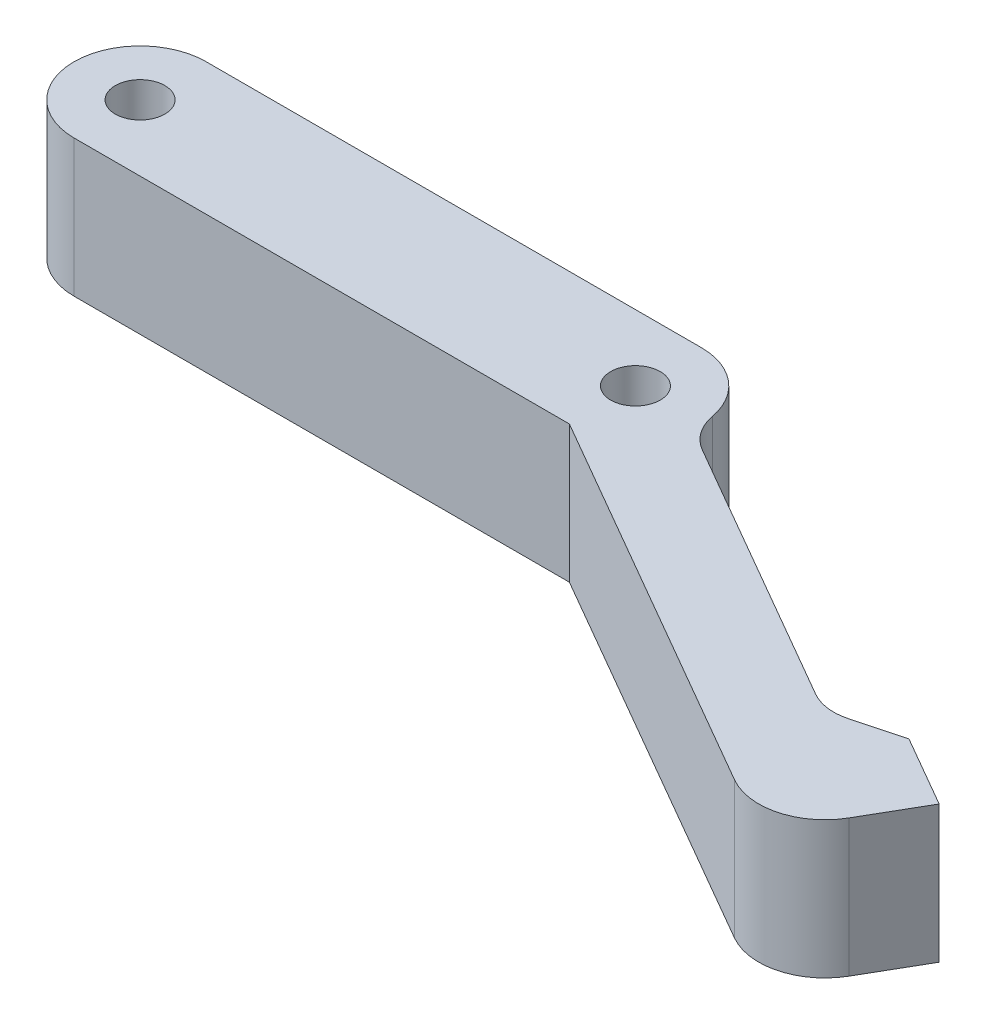
ISO-10303-21;
HEADER;
FILE_DESCRIPTION(('STEP AP214'),'2;1');
FILE_NAME('part.step','',(''),(''),'','','');
FILE_SCHEMA(('AUTOMOTIVE_DESIGN { 1 0 10303 214 1 1 1 1 }'));
ENDSEC;
DATA;
#1=APPLICATION_CONTEXT('core data for automotive mechanical design processes');
#2=APPLICATION_PROTOCOL_DEFINITION('international standard','automotive_design',2000,#1);
#3=PRODUCT_CONTEXT('',#1,'mechanical');
#4=PRODUCT('Part','Part','',(#3));
#5=PRODUCT_RELATED_PRODUCT_CATEGORY('part','',(#4));
#6=PRODUCT_DEFINITION_FORMATION('','',#4);
#7=PRODUCT_DEFINITION_CONTEXT('part definition',#1,'design');
#8=PRODUCT_DEFINITION('design','',#6,#7);
#9=PRODUCT_DEFINITION_SHAPE('','',#8);
#10=(LENGTH_UNIT() NAMED_UNIT(*) SI_UNIT(.MILLI.,.METRE.));
#11=(NAMED_UNIT(*) PLANE_ANGLE_UNIT() SI_UNIT($,.RADIAN.));
#12=(NAMED_UNIT(*) SI_UNIT($,.STERADIAN.) SOLID_ANGLE_UNIT());
#13=UNCERTAINTY_MEASURE_WITH_UNIT(LENGTH_MEASURE(1.E-05),#10,'distance_accuracy_value','');
#14=(GEOMETRIC_REPRESENTATION_CONTEXT(3) GLOBAL_UNCERTAINTY_ASSIGNED_CONTEXT((#13)) GLOBAL_UNIT_ASSIGNED_CONTEXT((#10,
#11,#12)) REPRESENTATION_CONTEXT('',''));
#15=CARTESIAN_POINT('',(0.,0.,0.));
#16=DIRECTION('',(0.,0.,1.));
#17=DIRECTION('',(1.,0.,0.));
#18=AXIS2_PLACEMENT_3D('',#15,#16,#17);
#19=CARTESIAN_POINT('',(8.2679491924312,8.3,-14.3205080756891));
#20=DIRECTION('',(0.499999999999995,0.,-0.866025403784442));
#21=DIRECTION('',(-0.866025403784442,0.,-0.499999999999995));
#22=AXIS2_PLACEMENT_3D('',#19,#20,#21);
#23=PLANE('',#22);
#24=DIRECTION('',(0.866025403784442,0.,0.499999999999995));
#25=VECTOR('',#24,1.);
#26=CARTESIAN_POINT('',(8.2679491924312,8.3,-14.3205080756891));
#27=LINE('',#26,#25);
#28=CARTESIAN_POINT('',(35.3852232130684,8.3,1.33565737981441));
#29=VERTEX_POINT('',#28);
#30=CARTESIAN_POINT('',(51.6230048712079,8.3,10.7105449911835));
#31=VERTEX_POINT('',#30);
#32=EDGE_CURVE('E128',#29,#31,#27,.T.);
#33=ORIENTED_EDGE('',*,*,#32,.T.);
#34=DIRECTION('',(0.,-1.,0.));
#35=VECTOR('',#34,1.);
#36=CARTESIAN_POINT('',(51.6230048712079,0.,10.7105449911835));
#37=LINE('',#36,#35);
#38=CARTESIAN_POINT('',(51.6230048712079,0.,10.7105449911835));
#39=VERTEX_POINT('',#38);
#40=EDGE_CURVE('E213',#31,#39,#37,.T.);
#41=ORIENTED_EDGE('',*,*,#40,.T.);
#42=DIRECTION('',(0.866025403784442,0.,0.499999999999995));
#43=VECTOR('',#42,1.);
#44=CARTESIAN_POINT('',(8.2679491924312,0.,-14.3205080756891));
#45=LINE('',#44,#43);
#46=CARTESIAN_POINT('',(35.3852232130684,0.,1.33565737981441));
#47=VERTEX_POINT('',#46);
#48=EDGE_CURVE('E170',#47,#39,#45,.T.);
#49=ORIENTED_EDGE('',*,*,#48,.F.);
#50=DIRECTION('',(0.,-1.,0.));
#51=VECTOR('',#50,1.);
#52=CARTESIAN_POINT('',(35.3852232130684,8.3,1.33565737981441));
#53=LINE('',#52,#51);
#54=EDGE_CURVE('E138',#47,#29,#53,.F.);
#55=ORIENTED_EDGE('',*,*,#54,.T.);
#56=EDGE_LOOP('',(#33,#41,#49,#55));
#57=FACE_BOUND('',#56,.T.);
#58=ADVANCED_FACE('F35',(#57),#23,.T.);
#59=CARTESIAN_POINT('',(30.,8.3,0.));
#60=DIRECTION('',(0.,-1.,0.));
#61=DIRECTION('',(0.,0.,-1.));
#62=AXIS2_PLACEMENT_3D('',#59,#60,#61);
#63=CYLINDRICAL_SURFACE('',#62,4.);
#64=CARTESIAN_POINT('',(30.,8.3,0.));
#65=DIRECTION('',(0.,1.,0.));
#66=DIRECTION('',(0.,0.,1.));
#67=AXIS2_PLACEMENT_3D('',#64,#65,#66);
#68=CIRCLE('',#67,4.);
#69=CARTESIAN_POINT('',(33.9344132646105,8.3,-0.721382189450805));
#70=VERTEX_POINT('',#69);
#71=CARTESIAN_POINT('',(30.,8.3,-4.));
#72=VERTEX_POINT('',#71);
#73=EDGE_CURVE('E121',#70,#72,#68,.T.);
#74=ORIENTED_EDGE('',*,*,#73,.F.);
#75=DIRECTION('',(0.,-1.,0.));
#76=VECTOR('',#75,1.);
#77=CARTESIAN_POINT('',(33.9344132646105,8.3,-0.721382189450805));
#78=LINE('',#77,#76);
#79=CARTESIAN_POINT('',(33.9344132646105,0.,-0.721382189450805));
#80=VERTEX_POINT('',#79);
#81=EDGE_CURVE('E218',#70,#80,#78,.T.);
#82=ORIENTED_EDGE('',*,*,#81,.T.);
#83=CARTESIAN_POINT('',(30.,0.,0.));
#84=DIRECTION('',(0.,1.,0.));
#85=DIRECTION('',(0.,0.,1.));
#86=AXIS2_PLACEMENT_3D('',#83,#84,#85);
#87=CIRCLE('',#86,4.);
#88=CARTESIAN_POINT('',(30.,0.,-4.));
#89=VERTEX_POINT('',#88);
#90=EDGE_CURVE('E134',#80,#89,#87,.T.);
#91=ORIENTED_EDGE('',*,*,#90,.T.);
#92=DIRECTION('',(0.,-1.,0.));
#93=VECTOR('',#92,1.);
#94=CARTESIAN_POINT('',(30.,8.3,-4.));
#95=LINE('',#94,#93);
#96=EDGE_CURVE('E131',#72,#89,#95,.T.);
#97=ORIENTED_EDGE('',*,*,#96,.F.);
#98=EDGE_LOOP('',(#74,#82,#91,#97));
#99=FACE_BOUND('',#98,.T.);
#100=ADVANCED_FACE('F132',(#99),#63,.T.);
#101=CARTESIAN_POINT('',(0.,8.3,-4.));
#102=DIRECTION('',(0.,0.,-1.));
#103=DIRECTION('',(-1.,0.,0.));
#104=AXIS2_PLACEMENT_3D('',#101,#102,#103);
#105=PLANE('',#104);
#106=DIRECTION('',(1.,0.,0.));
#107=VECTOR('',#106,1.);
#108=CARTESIAN_POINT('',(0.,0.,-4.));
#109=LINE('',#108,#107);
#110=CARTESIAN_POINT('',(0.,0.,-4.));
#111=VERTEX_POINT('',#110);
#112=EDGE_CURVE('E174',#111,#89,#109,.T.);
#113=ORIENTED_EDGE('',*,*,#112,.F.);
#114=DIRECTION('',(0.,-1.,0.));
#115=VECTOR('',#114,1.);
#116=CARTESIAN_POINT('',(0.,8.3,-4.));
#117=LINE('',#116,#115);
#118=CARTESIAN_POINT('',(0.,8.3,-4.));
#119=VERTEX_POINT('',#118);
#120=EDGE_CURVE('E139',#119,#111,#117,.T.);
#121=ORIENTED_EDGE('',*,*,#120,.F.);
#122=DIRECTION('',(1.,0.,0.));
#123=VECTOR('',#122,1.);
#124=CARTESIAN_POINT('',(0.,8.3,-4.));
#125=LINE('',#124,#123);
#126=EDGE_CURVE('E126',#119,#72,#125,.T.);
#127=ORIENTED_EDGE('',*,*,#126,.T.);
#128=ORIENTED_EDGE('',*,*,#96,.T.);
#129=EDGE_LOOP('',(#113,#121,#127,#128));
#130=FACE_BOUND('',#129,.T.);
#131=ADVANCED_FACE('F141',(#130),#105,.T.);
#132=CARTESIAN_POINT('',(0.,8.3,0.));
#133=DIRECTION('',(0.,-1.,0.));
#134=DIRECTION('',(0.,0.,-1.));
#135=AXIS2_PLACEMENT_3D('',#132,#133,#134);
#136=CYLINDRICAL_SURFACE('',#135,4.);
#137=CARTESIAN_POINT('',(0.,0.,0.));
#138=DIRECTION('',(0.,1.,0.));
#139=DIRECTION('',(0.,0.,1.));
#140=AXIS2_PLACEMENT_3D('',#137,#138,#139);
#141=CIRCLE('',#140,4.);
#142=CARTESIAN_POINT('',(0.,0.,4.));
#143=VERTEX_POINT('',#142);
#144=EDGE_CURVE('E176',#111,#143,#141,.T.);
#145=ORIENTED_EDGE('',*,*,#144,.T.);
#146=DIRECTION('',(0.,-1.,0.));
#147=VECTOR('',#146,1.);
#148=CARTESIAN_POINT('',(0.,8.3,4.));
#149=LINE('',#148,#147);
#150=CARTESIAN_POINT('',(0.,8.3,4.));
#151=VERTEX_POINT('',#150);
#152=EDGE_CURVE('E208',#151,#143,#149,.T.);
#153=ORIENTED_EDGE('',*,*,#152,.F.);
#154=CARTESIAN_POINT('',(0.,8.3,0.));
#155=DIRECTION('',(0.,1.,0.));
#156=DIRECTION('',(0.,0.,1.));
#157=AXIS2_PLACEMENT_3D('',#154,#155,#156);
#158=CIRCLE('',#157,4.);
#159=EDGE_CURVE('E143',#119,#151,#158,.T.);
#160=ORIENTED_EDGE('',*,*,#159,.F.);
#161=ORIENTED_EDGE('',*,*,#120,.T.);
#162=EDGE_LOOP('',(#145,#153,#160,#161));
#163=FACE_BOUND('',#162,.T.);
#164=ADVANCED_FACE('F293',(#163),#136,.T.);
#165=CARTESIAN_POINT('',(0.,8.3,4.));
#166=DIRECTION('',(0.,0.,-1.));
#167=DIRECTION('',(-1.,0.,0.));
#168=AXIS2_PLACEMENT_3D('',#165,#166,#167);
#169=PLANE('',#168);
#170=DIRECTION('',(1.,0.,0.));
#171=VECTOR('',#170,1.);
#172=CARTESIAN_POINT('',(0.,0.,4.));
#173=LINE('',#172,#171);
#174=CARTESIAN_POINT('',(30.,0.,4.));
#175=VERTEX_POINT('',#174);
#176=EDGE_CURVE('E179',#143,#175,#173,.T.);
#177=ORIENTED_EDGE('',*,*,#176,.T.);
#178=DIRECTION('',(0.,-1.,0.));
#179=VECTOR('',#178,1.);
#180=CARTESIAN_POINT('',(30.,8.3,4.));
#181=LINE('',#180,#179);
#182=CARTESIAN_POINT('',(30.,8.3,4.));
#183=VERTEX_POINT('',#182);
#184=EDGE_CURVE('E206',#183,#175,#181,.T.);
#185=ORIENTED_EDGE('',*,*,#184,.F.);
#186=DIRECTION('',(1.,0.,0.));
#187=VECTOR('',#186,1.);
#188=CARTESIAN_POINT('',(0.,8.3,4.));
#189=LINE('',#188,#187);
#190=EDGE_CURVE('E145',#151,#183,#189,.T.);
#191=ORIENTED_EDGE('',*,*,#190,.F.);
#192=ORIENTED_EDGE('',*,*,#152,.T.);
#193=EDGE_LOOP('',(#177,#185,#191,#192));
#194=FACE_BOUND('',#193,.T.);
#195=ADVANCED_FACE('F289',(#194),#169,.F.);
#196=CARTESIAN_POINT('',(5.76794919243054,8.3,-9.99038105676613));
#197=DIRECTION('',(-0.499999999999979,0.,0.866025403784451));
#198=DIRECTION('',(0.866025403784451,0.,0.499999999999979));
#199=AXIS2_PLACEMENT_3D('',#196,#197,#198);
#200=PLANE('',#199);
#201=DIRECTION('',(-0.866025403784451,0.,-0.499999999999979));
#202=VECTOR('',#201,1.);
#203=CARTESIAN_POINT('',(5.76794919243054,0.,-9.99038105676613));
#204=LINE('',#203,#202);
#205=CARTESIAN_POINT('',(53.6632648891671,0.,17.6619923536653));
#206=VERTEX_POINT('',#205);
#207=EDGE_CURVE('E182',#206,#175,#204,.T.);
#208=ORIENTED_EDGE('',*,*,#207,.F.);
#209=DIRECTION('',(0.,-1.,0.));
#210=VECTOR('',#209,1.);
#211=CARTESIAN_POINT('',(53.6632648891671,8.3,17.6619923536653));
#212=LINE('',#211,#210);
#213=CARTESIAN_POINT('',(53.6632648891671,8.3,17.6619923536653));
#214=VERTEX_POINT('',#213);
#215=EDGE_CURVE('E204',#214,#206,#212,.T.);
#216=ORIENTED_EDGE('',*,*,#215,.F.);
#217=DIRECTION('',(-0.866025403784451,0.,-0.499999999999979));
#218=VECTOR('',#217,1.);
#219=CARTESIAN_POINT('',(5.76794919243054,8.3,-9.99038105676613));
#220=LINE('',#219,#218);
#221=EDGE_CURVE('E150',#214,#183,#220,.T.);
#222=ORIENTED_EDGE('',*,*,#221,.T.);
#223=ORIENTED_EDGE('',*,*,#184,.T.);
#224=EDGE_LOOP('',(#208,#216,#222,#223));
#225=FACE_BOUND('',#224,.T.);
#226=ADVANCED_FACE('F285',(#225),#200,.T.);
#227=CARTESIAN_POINT('',(55.6632648891671,8.3,14.1978907385277));
#228=DIRECTION('',(0.,-1.,0.));
#229=DIRECTION('',(0.,0.,-1.));
#230=AXIS2_PLACEMENT_3D('',#227,#228,#229);
#231=CYLINDRICAL_SURFACE('',#230,3.9999999999999);
#232=CARTESIAN_POINT('',(55.6632648891671,0.,14.1978907385277));
#233=DIRECTION('',(0.,1.,0.));
#234=DIRECTION('',(0.,0.,1.));
#235=AXIS2_PLACEMENT_3D('',#232,#233,#234);
#236=CIRCLE('',#235,3.9999999999999);
#237=CARTESIAN_POINT('',(59.1273665043049,0.,16.1978907385275));
#238=VERTEX_POINT('',#237);
#239=EDGE_CURVE('E185',#206,#238,#236,.T.);
#240=ORIENTED_EDGE('',*,*,#239,.T.);
#241=DIRECTION('',(0.,-1.,0.));
#242=VECTOR('',#241,1.);
#243=CARTESIAN_POINT('',(59.1273665043049,8.3,16.1978907385275));
#244=LINE('',#243,#242);
#245=CARTESIAN_POINT('',(59.1273665043049,8.3,16.1978907385275));
#246=VERTEX_POINT('',#245);
#247=EDGE_CURVE('E201',#246,#238,#244,.T.);
#248=ORIENTED_EDGE('',*,*,#247,.F.);
#249=CARTESIAN_POINT('',(55.6632648891671,8.3,14.1978907385277));
#250=DIRECTION('',(0.,1.,0.));
#251=DIRECTION('',(0.,0.,1.));
#252=AXIS2_PLACEMENT_3D('',#249,#250,#251);
#253=CIRCLE('',#252,3.9999999999999);
#254=EDGE_CURVE('E153',#214,#246,#253,.T.);
#255=ORIENTED_EDGE('',*,*,#254,.F.);
#256=ORIENTED_EDGE('',*,*,#215,.T.);
#257=EDGE_LOOP('',(#240,#248,#255,#256));
#258=FACE_BOUND('',#257,.T.);
#259=ADVANCED_FACE('F281',(#258),#231,.T.);
#260=CARTESIAN_POINT('',(51.3594173118736,8.3,29.6523734104323));
#261=DIRECTION('',(-0.866025403784441,0.,-0.499999999999997));
#262=DIRECTION('',(-0.499999999999997,0.,0.866025403784441));
#263=AXIS2_PLACEMENT_3D('',#260,#261,#262);
#264=PLANE('',#263);
#265=DIRECTION('',(0.499999999999997,0.,-0.866025403784441));
#266=VECTOR('',#265,1.);
#267=CARTESIAN_POINT('',(51.3594173118736,0.,29.6523734104323));
#268=LINE('',#267,#266);
#269=CARTESIAN_POINT('',(61.1273665043049,0.,12.7337891233898));
#270=VERTEX_POINT('',#269);
#271=EDGE_CURVE('E188',#238,#270,#268,.T.);
#272=ORIENTED_EDGE('',*,*,#271,.T.);
#273=DIRECTION('',(0.,-1.,0.));
#274=VECTOR('',#273,1.);
#275=CARTESIAN_POINT('',(61.1273665043049,8.3,12.7337891233898));
#276=LINE('',#275,#274);
#277=CARTESIAN_POINT('',(61.1273665043049,8.3,12.7337891233898));
#278=VERTEX_POINT('',#277);
#279=EDGE_CURVE('E199',#278,#270,#276,.T.);
#280=ORIENTED_EDGE('',*,*,#279,.F.);
#281=DIRECTION('',(0.499999999999997,0.,-0.866025403784441));
#282=VECTOR('',#281,1.);
#283=CARTESIAN_POINT('',(51.3594173118736,8.3,29.6523734104323));
#284=LINE('',#283,#282);
#285=EDGE_CURVE('E156',#246,#278,#284,.T.);
#286=ORIENTED_EDGE('',*,*,#285,.F.);
#287=ORIENTED_EDGE('',*,*,#247,.T.);
#288=EDGE_LOOP('',(#272,#280,#286,#287));
#289=FACE_BOUND('',#288,.T.);
#290=ADVANCED_FACE('F277',(#289),#264,.F.);
#291=CARTESIAN_POINT('',(9.76794919243118,8.3,-16.9185842870424));
#292=DIRECTION('',(0.499999999999995,0.,-0.866025403784442));
#293=DIRECTION('',(-0.866025403784442,0.,-0.499999999999995));
#294=AXIS2_PLACEMENT_3D('',#291,#292,#293);
#295=PLANE('',#294);
#296=DIRECTION('',(0.866025403784442,0.,0.499999999999995));
#297=VECTOR('',#296,1.);
#298=CARTESIAN_POINT('',(9.76794919243118,0.,-16.9185842870424));
#299=LINE('',#298,#297);
#300=CARTESIAN_POINT('',(56.7972394853826,0.,10.2337891233898));
#301=VERTEX_POINT('',#300);
#302=EDGE_CURVE('E191',#301,#270,#299,.T.);
#303=ORIENTED_EDGE('',*,*,#302,.F.);
#304=DIRECTION('',(0.,-1.,0.));
#305=VECTOR('',#304,1.);
#306=CARTESIAN_POINT('',(56.7972394853826,8.3,10.2337891233898));
#307=LINE('',#306,#305);
#308=CARTESIAN_POINT('',(56.7972394853826,8.3,10.2337891233898));
#309=VERTEX_POINT('',#308);
#310=EDGE_CURVE('E163',#309,#301,#307,.T.);
#311=ORIENTED_EDGE('',*,*,#310,.F.);
#312=DIRECTION('',(0.866025403784442,0.,0.499999999999995));
#313=VECTOR('',#312,1.);
#314=CARTESIAN_POINT('',(9.76794919243118,8.3,-16.9185842870424));
#315=LINE('',#314,#313);
#316=EDGE_CURVE('E158',#309,#278,#315,.T.);
#317=ORIENTED_EDGE('',*,*,#316,.T.);
#318=ORIENTED_EDGE('',*,*,#279,.T.);
#319=EDGE_LOOP('',(#303,#311,#317,#318));
#320=FACE_BOUND('',#319,.T.);
#321=ADVANCED_FACE('F248',(#320),#295,.T.);
#322=CARTESIAN_POINT('',(30.,8.3,0.));
#323=DIRECTION('',(0.,-1.,0.));
#324=DIRECTION('',(0.,0.,-1.));
#325=AXIS2_PLACEMENT_3D('',#322,#323,#324);
#326=CYLINDRICAL_SURFACE('',#325,1.50000000000001);
#327=CARTESIAN_POINT('',(30.,8.3,0.));
#328=DIRECTION('',(0.,1.,0.));
#329=DIRECTION('',(0.,0.,1.));
#330=AXIS2_PLACEMENT_3D('',#327,#328,#329);
#331=CIRCLE('',#330,1.50000000000001);
#332=CARTESIAN_POINT('',(30.,8.3,-1.50000000000001));
#333=VERTEX_POINT('',#332);
#334=EDGE_CURVE('E436',#333,#333,#331,.T.);
#335=CARTESIAN_POINT('',(30.,0.,0.));
#336=DIRECTION('',(0.,1.,0.));
#337=DIRECTION('',(0.,0.,1.));
#338=AXIS2_PLACEMENT_3D('',#335,#336,#337);
#339=CIRCLE('',#338,1.50000000000001);
#340=CARTESIAN_POINT('',(30.,0.,-1.50000000000001));
#341=VERTEX_POINT('',#340);
#342=EDGE_CURVE('E167',#341,#341,#339,.T.);
#343=CARTESIAN_POINT('',(30.,8.3,-1.50000000000001));
#344=CARTESIAN_POINT('',(30.,8.21354166666667,-1.50000000000001));
#345=CARTESIAN_POINT('',(30.,8.12708333333333,-1.50000000000001));
#346=CARTESIAN_POINT('',(30.,7.95416666666667,-1.50000000000001));
#347=CARTESIAN_POINT('',(30.,7.86770833333333,-1.50000000000001));
#348=CARTESIAN_POINT('',(30.,7.69479166666667,-1.50000000000001));
#349=CARTESIAN_POINT('',(30.,7.60833333333333,-1.50000000000001));
#350=CARTESIAN_POINT('',(30.,7.43541666666667,-1.50000000000001));
#351=CARTESIAN_POINT('',(30.,7.34895833333333,-1.50000000000001));
#352=CARTESIAN_POINT('',(30.,7.17604166666667,-1.50000000000001));
#353=CARTESIAN_POINT('',(30.,7.08958333333333,-1.50000000000001));
#354=CARTESIAN_POINT('',(30.,6.91666666666667,-1.50000000000001));
#355=CARTESIAN_POINT('',(30.,6.83020833333333,-1.50000000000001));
#356=CARTESIAN_POINT('',(30.,6.65729166666667,-1.50000000000001));
#357=CARTESIAN_POINT('',(30.,6.57083333333333,-1.50000000000001));
#358=CARTESIAN_POINT('',(30.,6.39791666666667,-1.50000000000001));
#359=CARTESIAN_POINT('',(30.,6.31145833333333,-1.50000000000001));
#360=CARTESIAN_POINT('',(30.,6.13854166666667,-1.50000000000001));
#361=CARTESIAN_POINT('',(30.,6.05208333333333,-1.50000000000001));
#362=CARTESIAN_POINT('',(30.,5.87916666666667,-1.50000000000001));
#363=CARTESIAN_POINT('',(30.,5.79270833333333,-1.50000000000001));
#364=CARTESIAN_POINT('',(30.,5.61979166666667,-1.50000000000001));
#365=CARTESIAN_POINT('',(30.,5.53333333333333,-1.50000000000001));
#366=CARTESIAN_POINT('',(30.,5.36041666666667,-1.50000000000001));
#367=CARTESIAN_POINT('',(30.,5.27395833333333,-1.50000000000001));
#368=CARTESIAN_POINT('',(30.,5.10104166666667,-1.50000000000001));
#369=CARTESIAN_POINT('',(30.,5.01458333333333,-1.50000000000001));
#370=CARTESIAN_POINT('',(30.,4.84166666666667,-1.50000000000001));
#371=CARTESIAN_POINT('',(30.,4.75520833333333,-1.50000000000001));
#372=CARTESIAN_POINT('',(30.,4.58229166666667,-1.50000000000001));
#373=CARTESIAN_POINT('',(30.,4.49583333333333,-1.50000000000001));
#374=CARTESIAN_POINT('',(30.,4.32291666666667,-1.50000000000001));
#375=CARTESIAN_POINT('',(30.,4.23645833333333,-1.50000000000001));
#376=CARTESIAN_POINT('',(30.,4.06354166666667,-1.50000000000001));
#377=CARTESIAN_POINT('',(30.,3.97708333333333,-1.50000000000001));
#378=CARTESIAN_POINT('',(30.,3.80416666666667,-1.50000000000001));
#379=CARTESIAN_POINT('',(30.,3.71770833333333,-1.50000000000001));
#380=CARTESIAN_POINT('',(30.,3.54479166666667,-1.50000000000001));
#381=CARTESIAN_POINT('',(30.,3.45833333333333,-1.50000000000001));
#382=CARTESIAN_POINT('',(30.,3.28541666666667,-1.50000000000001));
#383=CARTESIAN_POINT('',(30.,3.19895833333333,-1.50000000000001));
#384=CARTESIAN_POINT('',(30.,3.02604166666667,-1.50000000000001));
#385=CARTESIAN_POINT('',(30.,2.93958333333333,-1.50000000000001));
#386=CARTESIAN_POINT('',(30.,2.76666666666667,-1.50000000000001));
#387=CARTESIAN_POINT('',(30.,2.68020833333333,-1.50000000000001));
#388=CARTESIAN_POINT('',(30.,2.50729166666667,-1.50000000000001));
#389=CARTESIAN_POINT('',(30.,2.42083333333333,-1.50000000000001));
#390=CARTESIAN_POINT('',(30.,2.24791666666667,-1.50000000000001));
#391=CARTESIAN_POINT('',(30.,2.16145833333333,-1.50000000000001));
#392=CARTESIAN_POINT('',(30.,1.98854166666667,-1.50000000000001));
#393=CARTESIAN_POINT('',(30.,1.90208333333333,-1.50000000000001));
#394=CARTESIAN_POINT('',(30.,1.72916666666667,-1.50000000000001));
#395=CARTESIAN_POINT('',(30.,1.64270833333333,-1.50000000000001));
#396=CARTESIAN_POINT('',(30.,1.46979166666667,-1.50000000000001));
#397=CARTESIAN_POINT('',(30.,1.38333333333333,-1.50000000000001));
#398=CARTESIAN_POINT('',(30.,1.21041666666667,-1.50000000000001));
#399=CARTESIAN_POINT('',(30.,1.12395833333333,-1.50000000000001));
#400=CARTESIAN_POINT('',(30.,0.951041666666667,-1.50000000000001));
#401=CARTESIAN_POINT('',(30.,0.864583333333333,-1.50000000000001));
#402=CARTESIAN_POINT('',(30.,0.691666666666667,-1.50000000000001));
#403=CARTESIAN_POINT('',(30.,0.605208333333333,-1.50000000000001));
#404=CARTESIAN_POINT('',(30.,0.432291666666666,-1.50000000000001));
#405=CARTESIAN_POINT('',(30.,0.345833333333333,-1.50000000000001));
#406=CARTESIAN_POINT('',(30.,0.172916666666666,-1.50000000000001));
#407=CARTESIAN_POINT('',(30.,0.086458333333333,-1.50000000000001));
#408=CARTESIAN_POINT('',(30.,0.,-1.50000000000001));
#409=B_SPLINE_CURVE_WITH_KNOTS('',3,(#343,#344,#345,#346,#347,#348,#349,#350,#351,#352,#353,
#354,#355,#356,#357,#358,#359,#360,#361,#362,#363,#364,#365,#366,#367,#368,#369,#370,#371,#372,
#373,#374,#375,#376,#377,#378,#379,#380,#381,#382,#383,#384,#385,#386,#387,#388,#389,#390,#391,
#392,#393,#394,#395,#396,#397,#398,#399,#400,#401,#402,#403,#404,#405,#406,#407,#408),
.UNSPECIFIED.,.F.,.F.,(4,2,2,2,2,2,2,2,2,2,2,2,2,2,2,2,2,2,2,2,2,2,2,2,2,2,2,2,2,2,2,2,4),(0.,
0.259374999999999,0.518749999999999,0.778124999999999,1.0375,1.296875,1.55625,1.815625,2.075,
2.334375,2.59375,2.853125,3.1125,3.371875,3.63125,3.890625,4.15,4.409375,4.66875,4.928125,
5.1875,5.446875,5.70625,5.965625,6.225,6.484375,6.74375,7.003125,7.2625,7.521875,7.78125,
8.040625,8.3),.UNSPECIFIED.);
#410=EDGE_CURVE('BSEAM244',#333,#341,#409,.T.);
#411=ORIENTED_EDGE('',*,*,#334,.T.);
#412=ORIENTED_EDGE('',*,*,#342,.F.);
#413=ORIENTED_EDGE('',*,*,#410,.T.);
#414=ORIENTED_EDGE('',*,*,#410,.F.);
#415=EDGE_LOOP('',(#411,#413,#412,#414));
#416=FACE_BOUND('',#415,.T.);
#417=ADVANCED_FACE('F244',(#416),#326,.F.);
#418=CARTESIAN_POINT('',(0.,8.3,0.));
#419=DIRECTION('',(0.,-1.,0.));
#420=DIRECTION('',(0.,0.,-1.));
#421=AXIS2_PLACEMENT_3D('',#418,#419,#420);
#422=CYLINDRICAL_SURFACE('',#421,1.5);
#423=CARTESIAN_POINT('',(0.,8.3,0.));
#424=DIRECTION('',(0.,1.,0.));
#425=DIRECTION('',(0.,0.,1.));
#426=AXIS2_PLACEMENT_3D('',#423,#424,#425);
#427=CIRCLE('',#426,1.5);
#428=CARTESIAN_POINT('',(0.,8.3,-1.5));
#429=VERTEX_POINT('',#428);
#430=EDGE_CURVE('E196',#429,#429,#427,.T.);
#431=CARTESIAN_POINT('',(0.,0.,0.));
#432=DIRECTION('',(0.,1.,0.));
#433=DIRECTION('',(0.,0.,1.));
#434=AXIS2_PLACEMENT_3D('',#431,#432,#433);
#435=CIRCLE('',#434,1.5);
#436=CARTESIAN_POINT('',(0.,0.,-1.5));
#437=VERTEX_POINT('',#436);
#438=EDGE_CURVE('E164',#437,#437,#435,.T.);
#439=CARTESIAN_POINT('',(0.,8.3,-1.5));
#440=CARTESIAN_POINT('',(0.,8.21354166666667,-1.5));
#441=CARTESIAN_POINT('',(0.,8.12708333333333,-1.5));
#442=CARTESIAN_POINT('',(0.,7.95416666666667,-1.5));
#443=CARTESIAN_POINT('',(0.,7.86770833333333,-1.5));
#444=CARTESIAN_POINT('',(0.,7.69479166666667,-1.5));
#445=CARTESIAN_POINT('',(0.,7.60833333333333,-1.5));
#446=CARTESIAN_POINT('',(0.,7.43541666666667,-1.5));
#447=CARTESIAN_POINT('',(0.,7.34895833333333,-1.5));
#448=CARTESIAN_POINT('',(0.,7.17604166666667,-1.5));
#449=CARTESIAN_POINT('',(0.,7.08958333333333,-1.5));
#450=CARTESIAN_POINT('',(0.,6.91666666666667,-1.5));
#451=CARTESIAN_POINT('',(0.,6.83020833333333,-1.5));
#452=CARTESIAN_POINT('',(0.,6.65729166666667,-1.5));
#453=CARTESIAN_POINT('',(0.,6.57083333333333,-1.5));
#454=CARTESIAN_POINT('',(0.,6.39791666666667,-1.5));
#455=CARTESIAN_POINT('',(0.,6.31145833333333,-1.5));
#456=CARTESIAN_POINT('',(0.,6.13854166666667,-1.5));
#457=CARTESIAN_POINT('',(0.,6.05208333333333,-1.5));
#458=CARTESIAN_POINT('',(0.,5.87916666666667,-1.5));
#459=CARTESIAN_POINT('',(0.,5.79270833333333,-1.5));
#460=CARTESIAN_POINT('',(0.,5.61979166666667,-1.5));
#461=CARTESIAN_POINT('',(0.,5.53333333333333,-1.5));
#462=CARTESIAN_POINT('',(0.,5.36041666666667,-1.5));
#463=CARTESIAN_POINT('',(0.,5.27395833333333,-1.5));
#464=CARTESIAN_POINT('',(0.,5.10104166666667,-1.5));
#465=CARTESIAN_POINT('',(0.,5.01458333333333,-1.5));
#466=CARTESIAN_POINT('',(0.,4.84166666666667,-1.5));
#467=CARTESIAN_POINT('',(0.,4.75520833333333,-1.5));
#468=CARTESIAN_POINT('',(0.,4.58229166666667,-1.5));
#469=CARTESIAN_POINT('',(0.,4.49583333333333,-1.5));
#470=CARTESIAN_POINT('',(0.,4.32291666666667,-1.5));
#471=CARTESIAN_POINT('',(0.,4.23645833333333,-1.5));
#472=CARTESIAN_POINT('',(0.,4.06354166666667,-1.5));
#473=CARTESIAN_POINT('',(0.,3.97708333333333,-1.5));
#474=CARTESIAN_POINT('',(0.,3.80416666666667,-1.5));
#475=CARTESIAN_POINT('',(0.,3.71770833333333,-1.5));
#476=CARTESIAN_POINT('',(0.,3.54479166666667,-1.5));
#477=CARTESIAN_POINT('',(0.,3.45833333333333,-1.5));
#478=CARTESIAN_POINT('',(0.,3.28541666666667,-1.5));
#479=CARTESIAN_POINT('',(0.,3.19895833333333,-1.5));
#480=CARTESIAN_POINT('',(0.,3.02604166666667,-1.5));
#481=CARTESIAN_POINT('',(0.,2.93958333333333,-1.5));
#482=CARTESIAN_POINT('',(0.,2.76666666666667,-1.5));
#483=CARTESIAN_POINT('',(0.,2.68020833333333,-1.5));
#484=CARTESIAN_POINT('',(0.,2.50729166666667,-1.5));
#485=CARTESIAN_POINT('',(0.,2.42083333333333,-1.5));
#486=CARTESIAN_POINT('',(0.,2.24791666666667,-1.5));
#487=CARTESIAN_POINT('',(0.,2.16145833333333,-1.5));
#488=CARTESIAN_POINT('',(0.,1.98854166666667,-1.5));
#489=CARTESIAN_POINT('',(0.,1.90208333333333,-1.5));
#490=CARTESIAN_POINT('',(0.,1.72916666666667,-1.5));
#491=CARTESIAN_POINT('',(0.,1.64270833333333,-1.5));
#492=CARTESIAN_POINT('',(0.,1.46979166666667,-1.5));
#493=CARTESIAN_POINT('',(0.,1.38333333333333,-1.5));
#494=CARTESIAN_POINT('',(0.,1.21041666666667,-1.5));
#495=CARTESIAN_POINT('',(0.,1.12395833333333,-1.5));
#496=CARTESIAN_POINT('',(0.,0.951041666666667,-1.5));
#497=CARTESIAN_POINT('',(0.,0.864583333333333,-1.5));
#498=CARTESIAN_POINT('',(0.,0.691666666666667,-1.5));
#499=CARTESIAN_POINT('',(0.,0.605208333333333,-1.5));
#500=CARTESIAN_POINT('',(0.,0.432291666666666,-1.5));
#501=CARTESIAN_POINT('',(0.,0.345833333333333,-1.5));
#502=CARTESIAN_POINT('',(0.,0.172916666666666,-1.5));
#503=CARTESIAN_POINT('',(0.,0.086458333333333,-1.5));
#504=CARTESIAN_POINT('',(0.,0.,-1.5));
#505=B_SPLINE_CURVE_WITH_KNOTS('',3,(#439,#440,#441,#442,#443,#444,#445,#446,#447,#448,#449,
#450,#451,#452,#453,#454,#455,#456,#457,#458,#459,#460,#461,#462,#463,#464,#465,#466,#467,#468,
#469,#470,#471,#472,#473,#474,#475,#476,#477,#478,#479,#480,#481,#482,#483,#484,#485,#486,#487,
#488,#489,#490,#491,#492,#493,#494,#495,#496,#497,#498,#499,#500,#501,#502,#503,#504),
.UNSPECIFIED.,.F.,.F.,(4,2,2,2,2,2,2,2,2,2,2,2,2,2,2,2,2,2,2,2,2,2,2,2,2,2,2,2,2,2,2,2,4),(0.,
0.259374999999999,0.518749999999999,0.778124999999999,1.0375,1.296875,1.55625,1.815625,2.075,
2.334375,2.59375,2.853125,3.1125,3.371875,3.63125,3.890625,4.15,4.409375,4.66875,4.928125,
5.1875,5.446875,5.70625,5.965625,6.225,6.484375,6.74375,7.003125,7.2625,7.521875,7.78125,
8.040625,8.3),.UNSPECIFIED.);
#506=EDGE_CURVE('BSEAM247',#429,#437,#505,.T.);
#507=ORIENTED_EDGE('',*,*,#430,.T.);
#508=ORIENTED_EDGE('',*,*,#438,.F.);
#509=ORIENTED_EDGE('',*,*,#506,.T.);
#510=ORIENTED_EDGE('',*,*,#506,.F.);
#511=EDGE_LOOP('',(#507,#509,#508,#510));
#512=FACE_BOUND('',#511,.T.);
#513=ADVANCED_FACE('F247',(#512),#422,.F.);
#514=CARTESIAN_POINT('',(6.36314089395408,8.3,23.7475651119551));
#515=DIRECTION('',(-0.258819045102528,0.,-0.965925826289066));
#516=DIRECTION('',(-0.965925826289066,0.,0.258819045102528));
#517=AXIS2_PLACEMENT_3D('',#514,#515,#516);
#518=PLANE('',#517);
#519=DIRECTION('',(0.965925826289066,0.,-0.258819045102528));
#520=VECTOR('',#519,1.);
#521=CARTESIAN_POINT('',(6.36314089395408,0.,23.7475651119551));
#522=LINE('',#521,#520);
#523=CARTESIAN_POINT('',(53.8994620065155,0.,11.0102462586974));
#524=VERTEX_POINT('',#523);
#525=EDGE_CURVE('E194',#524,#301,#522,.T.);
#526=ORIENTED_EDGE('',*,*,#525,.F.);
#527=DIRECTION('',(0.,-1.,0.));
#528=VECTOR('',#527,1.);
#529=CARTESIAN_POINT('',(53.8994620065155,8.3,11.0102462586974));
#530=LINE('',#529,#528);
#531=CARTESIAN_POINT('',(53.8994620065155,8.3,11.0102462586974));
#532=VERTEX_POINT('',#531);
#533=EDGE_CURVE('E216',#524,#532,#530,.F.);
#534=ORIENTED_EDGE('',*,*,#533,.T.);
#535=DIRECTION('',(0.965925826289066,0.,-0.258819045102528));
#536=VECTOR('',#535,1.);
#537=CARTESIAN_POINT('',(6.36314089395408,8.3,23.7475651119551));
#538=LINE('',#537,#536);
#539=EDGE_CURVE('E161',#532,#309,#538,.T.);
#540=ORIENTED_EDGE('',*,*,#539,.T.);
#541=ORIENTED_EDGE('',*,*,#310,.T.);
#542=EDGE_LOOP('',(#526,#534,#540,#541));
#543=FACE_BOUND('',#542,.T.);
#544=ADVANCED_FACE('F251',(#543),#518,.T.);
#545=CARTESIAN_POINT('',(0.,8.3,0.));
#546=DIRECTION('',(0.,1.,0.));
#547=DIRECTION('',(0.,0.,1.));
#548=AXIS2_PLACEMENT_3D('',#545,#546,#547);
#549=PLANE('',#548);
#550=ORIENTED_EDGE('',*,*,#430,.F.);
#551=EDGE_LOOP('',(#550));
#552=FACE_BOUND('',#551,.T.);
#553=ORIENTED_EDGE('',*,*,#334,.F.);
#554=EDGE_LOOP('',(#553));
#555=FACE_BOUND('',#554,.T.);
#556=ORIENTED_EDGE('',*,*,#32,.F.);
#557=CARTESIAN_POINT('',(36.8852232130684,8.3,-1.26241883153891));
#558=DIRECTION('',(0.,1.,0.));
#559=DIRECTION('',(0.,0.,1.));
#560=AXIS2_PLACEMENT_3D('',#557,#558,#559);
#561=CIRCLE('',#560,3.);
#562=EDGE_CURVE('E11',#29,#70,#561,.F.);
#563=ORIENTED_EDGE('',*,*,#562,.T.);
#564=ORIENTED_EDGE('',*,*,#73,.T.);
#565=ORIENTED_EDGE('',*,*,#126,.F.);
#566=ORIENTED_EDGE('',*,*,#159,.T.);
#567=ORIENTED_EDGE('',*,*,#190,.T.);
#568=ORIENTED_EDGE('',*,*,#221,.F.);
#569=ORIENTED_EDGE('',*,*,#254,.T.);
#570=ORIENTED_EDGE('',*,*,#285,.T.);
#571=ORIENTED_EDGE('',*,*,#316,.F.);
#572=ORIENTED_EDGE('',*,*,#539,.F.);
#573=CARTESIAN_POINT('',(53.1230048712079,8.3,8.11246877983017));
#574=DIRECTION('',(0.,1.,0.));
#575=DIRECTION('',(0.,0.,1.));
#576=AXIS2_PLACEMENT_3D('',#573,#574,#575);
#577=CIRCLE('',#576,3.);
#578=EDGE_CURVE('E222',#532,#31,#577,.F.);
#579=ORIENTED_EDGE('',*,*,#578,.T.);
#580=EDGE_LOOP('',(#556,#563,#564,#565,#566,#567,#568,#569,#570,#571,#572,#579));
#581=FACE_BOUND('',#580,.T.);
#582=ADVANCED_FACE('F123',(#552,#555,#581),#549,.T.);
#583=CARTESIAN_POINT('',(0.,0.,0.));
#584=DIRECTION('',(0.,1.,0.));
#585=DIRECTION('',(0.,0.,1.));
#586=AXIS2_PLACEMENT_3D('',#583,#584,#585);
#587=PLANE('',#586);
#588=ORIENTED_EDGE('',*,*,#438,.T.);
#589=EDGE_LOOP('',(#588));
#590=FACE_BOUND('',#589,.T.);
#591=ORIENTED_EDGE('',*,*,#342,.T.);
#592=EDGE_LOOP('',(#591));
#593=FACE_BOUND('',#592,.T.);
#594=ORIENTED_EDGE('',*,*,#90,.F.);
#595=CARTESIAN_POINT('',(36.8852232130684,0.,-1.26241883153891));
#596=DIRECTION('',(0.,1.,0.));
#597=DIRECTION('',(0.,0.,1.));
#598=AXIS2_PLACEMENT_3D('',#595,#596,#597);
#599=CIRCLE('',#598,3.);
#600=EDGE_CURVE('E43',#80,#47,#599,.T.);
#601=ORIENTED_EDGE('',*,*,#600,.T.);
#602=ORIENTED_EDGE('',*,*,#48,.T.);
#603=CARTESIAN_POINT('',(53.1230048712079,0.,8.11246877983017));
#604=DIRECTION('',(0.,1.,0.));
#605=DIRECTION('',(0.,0.,1.));
#606=AXIS2_PLACEMENT_3D('',#603,#604,#605);
#607=CIRCLE('',#606,3.);
#608=EDGE_CURVE('E220',#39,#524,#607,.T.);
#609=ORIENTED_EDGE('',*,*,#608,.T.);
#610=ORIENTED_EDGE('',*,*,#525,.T.);
#611=ORIENTED_EDGE('',*,*,#302,.T.);
#612=ORIENTED_EDGE('',*,*,#271,.F.);
#613=ORIENTED_EDGE('',*,*,#239,.F.);
#614=ORIENTED_EDGE('',*,*,#207,.T.);
#615=ORIENTED_EDGE('',*,*,#176,.F.);
#616=ORIENTED_EDGE('',*,*,#144,.F.);
#617=ORIENTED_EDGE('',*,*,#112,.T.);
#618=EDGE_LOOP('',(#594,#601,#602,#609,#610,#611,#612,#613,#614,#615,#616,#617));
#619=FACE_BOUND('',#618,.T.);
#620=ADVANCED_FACE('F225',(#590,#593,#619),#587,.F.);
#621=CARTESIAN_POINT('',(53.1230048712079,8.3,8.11246877983017));
#622=DIRECTION('',(0.,1.,0.));
#623=DIRECTION('',(0.,0.,1.));
#624=AXIS2_PLACEMENT_3D('',#621,#622,#623);
#625=CYLINDRICAL_SURFACE('',#624,3.);
#626=ORIENTED_EDGE('',*,*,#578,.F.);
#627=ORIENTED_EDGE('',*,*,#533,.F.);
#628=ORIENTED_EDGE('',*,*,#608,.F.);
#629=ORIENTED_EDGE('',*,*,#40,.F.);
#630=EDGE_LOOP('',(#626,#627,#628,#629));
#631=FACE_BOUND('',#630,.T.);
#632=ADVANCED_FACE('F230',(#631),#625,.F.);
#633=CARTESIAN_POINT('',(36.8852232130684,8.3,-1.26241883153891));
#634=DIRECTION('',(0.,-1.,0.));
#635=DIRECTION('',(0.,0.,-1.));
#636=AXIS2_PLACEMENT_3D('',#633,#634,#635);
#637=CYLINDRICAL_SURFACE('',#636,3.);
#638=ORIENTED_EDGE('',*,*,#562,.F.);
#639=ORIENTED_EDGE('',*,*,#54,.F.);
#640=ORIENTED_EDGE('',*,*,#600,.F.);
#641=ORIENTED_EDGE('',*,*,#81,.F.);
#642=EDGE_LOOP('',(#638,#639,#640,#641));
#643=FACE_BOUND('',#642,.T.);
#644=ADVANCED_FACE('F37',(#643),#637,.F.);
#645=CLOSED_SHELL('',(#58,#100,#131,#164,#195,#226,#259,#290,#321,#417,#513,#544,#582,#620,#632,#644));
#646=MANIFOLD_SOLID_BREP('B2',#645);
#647=ADVANCED_BREP_SHAPE_REPRESENTATION('',(#18,#646),#14);
#648=SHAPE_DEFINITION_REPRESENTATION(#9,#647);
ENDSEC;
END-ISO-10303-21;
